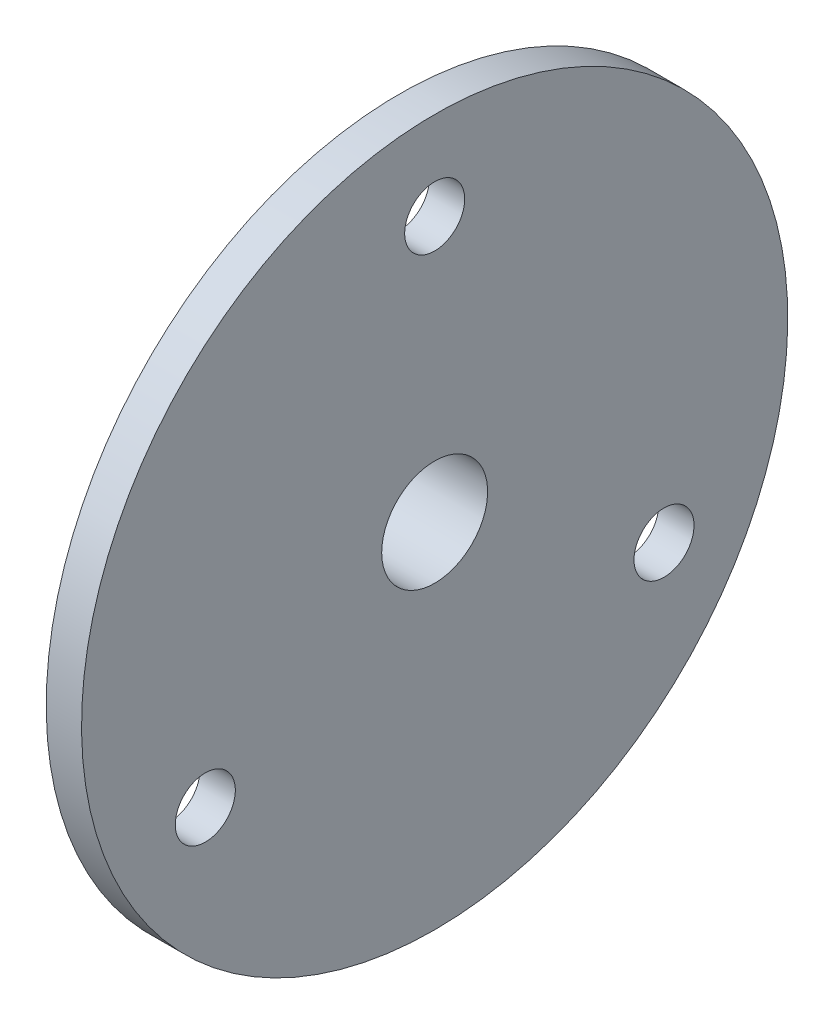
ISO-10303-21;
HEADER;
FILE_DESCRIPTION(('STEP AP214'),'2;1');
FILE_NAME('part.step','',(''),(''),'','','');
FILE_SCHEMA(('AUTOMOTIVE_DESIGN { 1 0 10303 214 1 1 1 1 }'));
ENDSEC;
DATA;
#1=APPLICATION_CONTEXT('core data for automotive mechanical design processes');
#2=APPLICATION_PROTOCOL_DEFINITION('international standard','automotive_design',2000,#1);
#3=PRODUCT_CONTEXT('',#1,'mechanical');
#4=PRODUCT('Part','Part','',(#3));
#5=PRODUCT_RELATED_PRODUCT_CATEGORY('part','',(#4));
#6=PRODUCT_DEFINITION_FORMATION('','',#4);
#7=PRODUCT_DEFINITION_CONTEXT('part definition',#1,'design');
#8=PRODUCT_DEFINITION('design','',#6,#7);
#9=PRODUCT_DEFINITION_SHAPE('','',#8);
#10=(LENGTH_UNIT() NAMED_UNIT(*) SI_UNIT(.MILLI.,.METRE.));
#11=(NAMED_UNIT(*) PLANE_ANGLE_UNIT() SI_UNIT($,.RADIAN.));
#12=(NAMED_UNIT(*) SI_UNIT($,.STERADIAN.) SOLID_ANGLE_UNIT());
#13=UNCERTAINTY_MEASURE_WITH_UNIT(LENGTH_MEASURE(1.E-05),#10,'distance_accuracy_value','');
#14=(GEOMETRIC_REPRESENTATION_CONTEXT(3) GLOBAL_UNCERTAINTY_ASSIGNED_CONTEXT((#13)) GLOBAL_UNIT_ASSIGNED_CONTEXT((#10,
#11,#12)) REPRESENTATION_CONTEXT('',''));
#15=CARTESIAN_POINT('',(0.,0.,0.));
#16=DIRECTION('',(0.,0.,1.));
#17=DIRECTION('',(1.,0.,0.));
#18=AXIS2_PLACEMENT_3D('',#15,#16,#17);
#19=CARTESIAN_POINT('',(1.,0.,0.));
#20=DIRECTION('',(-1.,0.,0.));
#21=DIRECTION('',(0.,-1.,0.));
#22=AXIS2_PLACEMENT_3D('',#19,#20,#21);
#23=PLANE('',#22);
#24=CARTESIAN_POINT('',(0.999999999999898,15.,0.));
#25=DIRECTION('',(-1.,0.,0.));
#26=DIRECTION('',(0.,0.,1.));
#27=AXIS2_PLACEMENT_3D('',#24,#25,#26);
#28=CIRCLE('',#27,1.7);
#29=CARTESIAN_POINT('',(0.999999999999898,15.,1.7));
#30=VERTEX_POINT('',#29);
#31=EDGE_CURVE('E109',#30,#30,#28,.T.);
#32=ORIENTED_EDGE('',*,*,#31,.T.);
#33=EDGE_LOOP('',(#32));
#34=FACE_BOUND('',#33,.T.);
#35=CARTESIAN_POINT('',(0.999999999999902,-7.5,12.9903810567666));
#36=DIRECTION('',(-1.,0.,0.));
#37=DIRECTION('',(0.,0.,1.));
#38=AXIS2_PLACEMENT_3D('',#35,#36,#37);
#39=CIRCLE('',#38,1.7);
#40=CARTESIAN_POINT('',(0.999999999999902,-7.5,14.6903810567666));
#41=VERTEX_POINT('',#40);
#42=EDGE_CURVE('E113',#41,#41,#39,.T.);
#43=ORIENTED_EDGE('',*,*,#42,.T.);
#44=EDGE_LOOP('',(#43));
#45=FACE_BOUND('',#44,.T.);
#46=CARTESIAN_POINT('',(0.999999999999902,-7.5,-12.9903810567666));
#47=DIRECTION('',(-1.,0.,0.));
#48=DIRECTION('',(0.,0.,1.));
#49=AXIS2_PLACEMENT_3D('',#46,#47,#48);
#50=CIRCLE('',#49,1.7);
#51=CARTESIAN_POINT('',(0.999999999999902,-7.5,-11.2903810567666));
#52=VERTEX_POINT('',#51);
#53=EDGE_CURVE('E73',#52,#52,#50,.T.);
#54=ORIENTED_EDGE('',*,*,#53,.T.);
#55=EDGE_LOOP('',(#54));
#56=FACE_BOUND('',#55,.T.);
#57=CARTESIAN_POINT('',(0.999999999999897,0.,0.));
#58=DIRECTION('',(-1.,0.,0.));
#59=DIRECTION('',(0.,0.,1.));
#60=AXIS2_PLACEMENT_3D('',#57,#58,#59);
#61=CIRCLE('',#60,3.);
#62=CARTESIAN_POINT('',(0.999999999999897,0.,3.));
#63=VERTEX_POINT('',#62);
#64=EDGE_CURVE('E61',#63,#63,#61,.T.);
#65=ORIENTED_EDGE('',*,*,#64,.T.);
#66=EDGE_LOOP('',(#65));
#67=FACE_BOUND('',#66,.T.);
#68=CARTESIAN_POINT('',(0.99999999999989,0.,0.));
#69=DIRECTION('',(-1.,0.,0.));
#70=DIRECTION('',(0.,-1.,0.));
#71=AXIS2_PLACEMENT_3D('',#68,#69,#70);
#72=CIRCLE('',#71,20.);
#73=CARTESIAN_POINT('',(0.999999999999894,-20.,0.));
#74=VERTEX_POINT('',#73);
#75=EDGE_CURVE('E45',#74,#74,#72,.T.);
#76=ORIENTED_EDGE('',*,*,#75,.F.);
#77=EDGE_LOOP('',(#76));
#78=FACE_BOUND('',#77,.T.);
#79=ADVANCED_FACE('F35',(#34,#45,#56,#67,#78),#23,.F.);
#80=CARTESIAN_POINT('',(-1031.23106333533,-1.87350135405495E-13,0.));
#81=DIRECTION('',(-1.,0.,0.));
#82=DIRECTION('',(0.,-1.,0.));
#83=AXIS2_PLACEMENT_3D('',#80,#81,#82);
#84=CYLINDRICAL_SURFACE('',#83,20.);
#85=CARTESIAN_POINT('',(-0.99999999999989,0.,0.));
#86=DIRECTION('',(-1.,0.,0.));
#87=DIRECTION('',(0.,-1.,0.));
#88=AXIS2_PLACEMENT_3D('',#85,#86,#87);
#89=CIRCLE('',#88,20.);
#90=CARTESIAN_POINT('',(-0.999999999999886,-20.,0.));
#91=VERTEX_POINT('',#90);
#92=EDGE_CURVE('E49',#91,#91,#89,.T.);
#93=ORIENTED_EDGE('',*,*,#92,.F.);
#94=EDGE_LOOP('',(#93));
#95=FACE_BOUND('',#94,.T.);
#96=ORIENTED_EDGE('',*,*,#75,.T.);
#97=EDGE_LOOP('',(#96));
#98=FACE_BOUND('',#97,.T.);
#99=ADVANCED_FACE('F100',(#95,#98),#84,.T.);
#100=CARTESIAN_POINT('',(-0.999999999999998,5.,0.));
#101=DIRECTION('',(1.,0.,0.));
#102=DIRECTION('',(0.,1.,0.));
#103=AXIS2_PLACEMENT_3D('',#100,#101,#102);
#104=PLANE('',#103);
#105=CARTESIAN_POINT('',(-1.,15.,0.));
#106=DIRECTION('',(-1.,0.,0.));
#107=DIRECTION('',(0.,0.,1.));
#108=AXIS2_PLACEMENT_3D('',#105,#106,#107);
#109=CIRCLE('',#108,1.69999999999999);
#110=CARTESIAN_POINT('',(-1.,15.,1.69999999999999));
#111=VERTEX_POINT('',#110);
#112=EDGE_CURVE('E146',#111,#111,#109,.T.);
#113=ORIENTED_EDGE('',*,*,#112,.F.);
#114=EDGE_LOOP('',(#113));
#115=FACE_BOUND('',#114,.T.);
#116=CARTESIAN_POINT('',(-0.999999999999997,-7.5,12.9903810567666));
#117=DIRECTION('',(-1.,0.,0.));
#118=DIRECTION('',(0.,0.,1.));
#119=AXIS2_PLACEMENT_3D('',#116,#117,#118);
#120=CIRCLE('',#119,1.69999999999999);
#121=CARTESIAN_POINT('',(-0.999999999999997,-7.5,14.6903810567666));
#122=VERTEX_POINT('',#121);
#123=EDGE_CURVE('E150',#122,#122,#120,.T.);
#124=ORIENTED_EDGE('',*,*,#123,.F.);
#125=EDGE_LOOP('',(#124));
#126=FACE_BOUND('',#125,.T.);
#127=CARTESIAN_POINT('',(-0.999999999999997,-7.5,-12.9903810567666));
#128=DIRECTION('',(-1.,0.,0.));
#129=DIRECTION('',(0.,0.,1.));
#130=AXIS2_PLACEMENT_3D('',#127,#128,#129);
#131=CIRCLE('',#130,1.69999999999999);
#132=CARTESIAN_POINT('',(-0.999999999999997,-7.5,-11.2903810567666));
#133=VERTEX_POINT('',#132);
#134=EDGE_CURVE('E153',#133,#133,#131,.T.);
#135=ORIENTED_EDGE('',*,*,#134,.F.);
#136=EDGE_LOOP('',(#135));
#137=FACE_BOUND('',#136,.T.);
#138=CARTESIAN_POINT('',(-0.99999999999989,0.,0.));
#139=DIRECTION('',(-1.,0.,0.));
#140=DIRECTION('',(0.,-1.,0.));
#141=AXIS2_PLACEMENT_3D('',#138,#139,#140);
#142=CIRCLE('',#141,5.);
#143=CARTESIAN_POINT('',(-0.999999999999889,-5.,0.));
#144=VERTEX_POINT('',#143);
#145=EDGE_CURVE('E53',#144,#144,#142,.T.);
#146=ORIENTED_EDGE('',*,*,#145,.F.);
#147=EDGE_LOOP('',(#146));
#148=FACE_BOUND('',#147,.T.);
#149=ORIENTED_EDGE('',*,*,#92,.T.);
#150=EDGE_LOOP('',(#149));
#151=FACE_BOUND('',#150,.T.);
#152=ADVANCED_FACE('F105',(#115,#126,#137,#148,#151),#104,.F.);
#153=CARTESIAN_POINT('',(-1031.23106333533,-1.87350135405495E-13,0.));
#154=DIRECTION('',(-1.,0.,0.));
#155=DIRECTION('',(0.,-1.,0.));
#156=AXIS2_PLACEMENT_3D('',#153,#154,#155);
#157=CYLINDRICAL_SURFACE('',#156,5.);
#158=CARTESIAN_POINT('',(-4.5,4.71990466005406,1.64999999999999));
#159=CARTESIAN_POINT('',(-4.58992939929062,4.71990452115883,1.65000024360503));
#160=CARTESIAN_POINT('',(-4.67985768649969,4.72250292266519,1.64262303818654));
#161=CARTESIAN_POINT('',(-4.85705367343517,4.73256311651638,1.61340616817483));
#162=CARTESIAN_POINT('',(-4.94432088746039,4.74002579119602,1.59156387973589));
#163=CARTESIAN_POINT('',(-5.11359969937907,4.75887919770346,1.53426465819808));
#164=CARTESIAN_POINT('',(-5.19562107766353,4.77026235105614,1.49883397722406));
#165=CARTESIAN_POINT('',(-5.3525814963571,4.79566317693292,1.41545303535855));
#166=CARTESIAN_POINT('',(-5.42751901846369,4.80968141232602,1.36750009878646));
#167=CARTESIAN_POINT('',(-5.57105763938824,4.83937566103107,1.25846654308765));
#168=CARTESIAN_POINT('',(-5.63934748573353,4.85509238793419,1.1969871597991));
#169=CARTESIAN_POINT('',(-5.76485926767888,4.8860682262247,1.06349727663171));
#170=CARTESIAN_POINT('',(-5.82207946546599,4.90132726544298,0.991485126335473));
#171=CARTESIAN_POINT('',(-5.92523358902281,4.93013890958224,0.836704215602397));
#172=CARTESIAN_POINT('',(-5.97084230640668,4.94363804307574,0.753707887278361));
#173=CARTESIAN_POINT('',(-6.04732873484976,4.96692987406679,0.580699685040883));
#174=CARTESIAN_POINT('',(-6.07821033205654,4.97672354920831,0.490689669179503));
#175=CARTESIAN_POINT('',(-6.12331307187515,4.99121262924257,0.309471831071057));
#176=CARTESIAN_POINT('',(-6.13806721498853,4.99607073696453,0.218409916306844));
#177=CARTESIAN_POINT('',(-6.1521899987148,5.00071837425093,0.0349820134684155));
#178=CARTESIAN_POINT('',(-6.15156252784608,5.00050918484353,-0.0573836391159477));
#179=CARTESIAN_POINT('',(-6.13528002545685,4.99515654976728,-0.237027933093925));
#180=CARTESIAN_POINT('',(-6.1202037350628,4.99020313675408,-0.324365615952688));
#181=CARTESIAN_POINT('',(-6.0764073968143,4.9761564157389,-0.49519357766901));
#182=CARTESIAN_POINT('',(-6.04768642917573,4.96706282865059,-0.578683596740282));
#183=CARTESIAN_POINT('',(-5.97707262193577,4.94551338736031,-0.740723104693062));
#184=CARTESIAN_POINT('',(-5.93501331574258,4.93301533884174,-0.819194207586595));
#185=CARTESIAN_POINT('',(-5.83905332496134,4.90596050876767,-0.968137400016378));
#186=CARTESIAN_POINT('',(-5.78514939427669,4.89140316323875,-1.03860728872217));
#187=CARTESIAN_POINT('',(-5.66410482353283,4.86097294536879,-1.1729917525873));
#188=CARTESIAN_POINT('',(-5.59646769426564,4.84507036749807,-1.23645304594368));
#189=CARTESIAN_POINT('',(-5.45137341036442,4.81431124792123,-1.35127700383061));
#190=CARTESIAN_POINT('',(-5.37391480695885,4.79945486104327,-1.4026378802203));
#191=CARTESIAN_POINT('',(-5.20996560114244,4.77230967313122,-1.49241382326107));
#192=CARTESIAN_POINT('',(-5.12336561233862,4.76005891661914,-1.53064150543129));
#193=CARTESIAN_POINT('',(-4.94445239284249,4.73995346804782,-1.59181981773763));
#194=CARTESIAN_POINT('',(-4.85214151654173,4.73209697762927,-1.61477669819906));
#195=CARTESIAN_POINT('',(-4.66880983230074,4.72207527963097,-1.6438468259232));
#196=CARTESIAN_POINT('',(-4.5779131556508,4.71967327795614,-1.65066145601709));
#197=CARTESIAN_POINT('',(-4.39626215211206,4.7201713665852,-1.64923749492086));
#198=CARTESIAN_POINT('',(-4.30550780287081,4.72307051828914,-1.64100156851917));
#199=CARTESIAN_POINT('',(-4.12987992776333,4.73360855675225,-1.61033997123774));
#200=CARTESIAN_POINT('',(-4.04491123060324,4.74108573426459,-1.5883979271959));
#201=CARTESIAN_POINT('',(-3.87987739298326,4.75976051805482,-1.53152522846696));
#202=CARTESIAN_POINT('',(-3.7998131136739,4.77095877549974,-1.49659230032422));
#203=CARTESIAN_POINT('',(-3.64408997295919,4.79624726899171,-1.41348842564754));
#204=CARTESIAN_POINT('',(-3.56864683097438,4.81041691149476,-1.36493806698654));
#205=CARTESIAN_POINT('',(-3.42672439625333,4.83989585604412,-1.25640957990472));
#206=CARTESIAN_POINT('',(-3.36024770467313,4.85520548680903,-1.19642814746825));
#207=CARTESIAN_POINT('',(-3.23491681921652,4.88610989384611,-1.06339123842035));
#208=CARTESIAN_POINT('',(-3.17656776107348,4.9016842503764,-0.989853763923046));
#209=CARTESIAN_POINT('',(-3.07300735840891,4.93065204495412,-0.833649177353401));
#210=CARTESIAN_POINT('',(-3.02779552094755,4.94404556482344,-0.750982407994637));
#211=CARTESIAN_POINT('',(-2.95221100774122,4.96707750850082,-0.579295715379795));
#212=CARTESIAN_POINT('',(-2.92173954125647,4.976740841375,-0.490322802958601));
#213=CARTESIAN_POINT('',(-2.87631330680774,4.99133146825929,-0.308134735858253));
#214=CARTESIAN_POINT('',(-2.86135306153476,4.99626043401974,-0.214921090808601));
#215=CARTESIAN_POINT('',(-2.84785918214314,5.00070328980922,-0.0315225864698995));
#216=CARTESIAN_POINT('',(-2.84859968791083,5.00045646732493,0.05860365806687));
#217=CARTESIAN_POINT('',(-2.86470152427364,4.99516201889142,0.237388028290531));
#218=CARTESIAN_POINT('',(-2.88006170828972,4.99011476942582,0.32604626855399));
#219=CARTESIAN_POINT('',(-2.92448830592424,4.97587240449465,0.498029665785517));
#220=CARTESIAN_POINT('',(-2.95334133491917,4.96674195827475,0.581415680377157));
#221=CARTESIAN_POINT('',(-3.02373789478141,4.94527347683187,0.742196807428919));
#222=CARTESIAN_POINT('',(-3.06528370511946,4.93293486552038,0.819590840669547));
#223=CARTESIAN_POINT('',(-3.16163265392507,4.90576374946711,0.969268380933019));
#224=CARTESIAN_POINT('',(-3.21686414809695,4.89085668492739,1.04126244269286));
#225=CARTESIAN_POINT('',(-3.3382836506441,4.86041514438607,1.17519818555166));
#226=CARTESIAN_POINT('',(-3.40447511929778,4.84488047141097,1.23713667964078));
#227=CARTESIAN_POINT('',(-3.54895585145464,4.81423121094682,1.35160179814246));
#228=CARTESIAN_POINT('',(-3.62761026948916,4.79915525016868,1.40367929286429));
#229=CARTESIAN_POINT('',(-3.79302166212418,4.77186368687929,1.49383628223877));
#230=CARTESIAN_POINT('',(-3.87977631283495,4.759647267495,1.5319197762739));
#231=CARTESIAN_POINT('',(-4.05434327244323,4.74014636717988,1.59120734764471));
#232=CARTESIAN_POINT('',(-4.14186804193521,4.7326392026776,1.61318355190477));
#233=CARTESIAN_POINT('',(-4.31959617129269,4.72251921935149,1.64257737451178));
#234=CARTESIAN_POINT('',(-4.40979864505525,4.71990479936932,1.64999975565827));
#235=CARTESIAN_POINT('',(-4.5,4.71990466005406,1.64999999999999));
#236=B_SPLINE_CURVE_WITH_KNOTS('',3,(#158,#159,#160,#161,#162,#163,#164,#165,#166,#167,#168,
#169,#170,#171,#172,#173,#174,#175,#176,#177,#178,#179,#180,#181,#182,#183,#184,#185,#186,#187,
#188,#189,#190,#191,#192,#193,#194,#195,#196,#197,#198,#199,#200,#201,#202,#203,#204,#205,#206,
#207,#208,#209,#210,#211,#212,#213,#214,#215,#216,#217,#218,#219,#220,#221,#222,#223,#224,#225,
#226,#227,#228,#229,#230,#231,#232,#233,#234,#235),.UNSPECIFIED.,.T.,.F.,(4,2,2,2,2,2,2,2,2,2,2,
2,2,2,2,2,2,2,2,2,2,2,2,2,2,2,2,2,2,2,2,2,2,2,2,2,2,2,4),(0.,0.269454302916433,
0.538957495994023,0.807942623457627,1.07698527314816,1.35539043483169,1.63383926765626,
1.91939248597707,2.20487031163409,2.48059787689521,2.75625573811557,3.02131448573183,
3.28639110342469,3.55491555402298,3.82351368748602,4.10452131305697,4.38557043856027,
4.67047751353533,4.95526790443247,5.22743703243197,5.49955797597571,5.76258081799805,
6.02564971172705,6.29693565916081,6.56830013781583,6.85241935986187,7.13652791970019,
7.41870503995778,7.70078248410445,7.96984890311452,8.23889422176273,8.50382155957886,
8.76879650315112,9.04343817678382,9.3181667260818,9.60337461850673,9.88850093710111,
10.1588585876966,10.4291277478431),.UNSPECIFIED.);
#237=CARTESIAN_POINT('',(-4.5,4.71990466005406,1.64999999999999));
#238=VERTEX_POINT('',#237);
#239=EDGE_CURVE('E10',#238,#238,#236,.T.);
#240=ORIENTED_EDGE('',*,*,#239,.T.);
#241=EDGE_LOOP('',(#240));
#242=FACE_BOUND('',#241,.T.);
#243=CARTESIAN_POINT('',(-8.00000000000001,0.,0.));
#244=DIRECTION('',(-1.,0.,0.));
#245=DIRECTION('',(0.,-1.,0.));
#246=AXIS2_PLACEMENT_3D('',#243,#244,#245);
#247=CIRCLE('',#246,5.);
#248=CARTESIAN_POINT('',(-8.00000000000001,-5.,0.));
#249=VERTEX_POINT('',#248);
#250=EDGE_CURVE('E58',#249,#249,#247,.T.);
#251=ORIENTED_EDGE('',*,*,#250,.F.);
#252=EDGE_LOOP('',(#251));
#253=FACE_BOUND('',#252,.T.);
#254=ORIENTED_EDGE('',*,*,#145,.T.);
#255=EDGE_LOOP('',(#254));
#256=FACE_BOUND('',#255,.T.);
#257=ADVANCED_FACE('F128',(#242,#253,#256),#157,.T.);
#258=CARTESIAN_POINT('',(-8.,0.,0.));
#259=DIRECTION('',(1.,0.,0.));
#260=DIRECTION('',(0.,1.,0.));
#261=AXIS2_PLACEMENT_3D('',#258,#259,#260);
#262=PLANE('',#261);
#263=CARTESIAN_POINT('',(-8.,0.,0.));
#264=DIRECTION('',(-1.,0.,0.));
#265=DIRECTION('',(0.,0.,1.));
#266=AXIS2_PLACEMENT_3D('',#263,#264,#265);
#267=CIRCLE('',#266,3.);
#268=CARTESIAN_POINT('',(-8.,0.,3.));
#269=VERTEX_POINT('',#268);
#270=EDGE_CURVE('E64',#269,#269,#267,.T.);
#271=ORIENTED_EDGE('',*,*,#270,.F.);
#272=EDGE_LOOP('',(#271));
#273=FACE_BOUND('',#272,.T.);
#274=ORIENTED_EDGE('',*,*,#250,.T.);
#275=EDGE_LOOP('',(#274));
#276=FACE_BOUND('',#275,.T.);
#277=ADVANCED_FACE('F122',(#273,#276),#262,.F.);
#278=CARTESIAN_POINT('',(-8.,0.,0.));
#279=DIRECTION('',(-1.,0.,0.));
#280=DIRECTION('',(0.,0.,1.));
#281=AXIS2_PLACEMENT_3D('',#278,#279,#280);
#282=CYLINDRICAL_SURFACE('',#281,3.);
#283=CARTESIAN_POINT('',(-4.5,2.50549396327351,1.64999999999999));
#284=CARTESIAN_POINT('',(-4.41543775587578,2.50550290729145,1.64999358115514));
#285=CARTESIAN_POINT('',(-4.33080158035625,2.50984278304633,1.64345412095508));
#286=CARTESIAN_POINT('',(-4.16424198934389,2.52652305472093,1.61768357796128));
#287=CARTESIAN_POINT('',(-4.08232339226291,2.5388769381334,1.59843109830519));
#288=CARTESIAN_POINT('',(-3.92394184165835,2.56969514424061,1.54839133504121));
#289=CARTESIAN_POINT('',(-3.84744833636022,2.58812128253767,1.51767597794515));
#290=CARTESIAN_POINT('',(-3.70072925067674,2.62894573960704,1.44580368027315));
#291=CARTESIAN_POINT('',(-3.63050498062123,2.65134488586739,1.40464456372701));
#292=CARTESIAN_POINT('',(-3.49050697951391,2.70034227169485,1.30818987552102));
#293=CARTESIAN_POINT('',(-3.42149614307965,2.72713610292843,1.25188597568528));
#294=CARTESIAN_POINT('',(-3.29328457524384,2.78033402122329,1.12882249865068));
#295=CARTESIAN_POINT('',(-3.23408972055437,2.8067378662503,1.06205670422282));
#296=CARTESIAN_POINT('',(-3.12218721247504,2.85888255333956,0.912984038802338));
#297=CARTESIAN_POINT('',(-3.07047291087437,2.88437182872328,0.829835009326249));
#298=CARTESIAN_POINT('',(-2.98212209381967,2.92916377464779,0.65434955639789));
#299=CARTESIAN_POINT('',(-2.94547408910424,2.94847115688416,0.562020200659681));
#300=CARTESIAN_POINT('',(-2.89150601520037,2.9772938233039,0.378922854343169));
#301=CARTESIAN_POINT('',(-2.87283185672805,2.98749000620555,0.288663762188306));
#302=CARTESIAN_POINT('',(-2.85082522164806,2.99953120217528,0.105768848971923));
#303=CARTESIAN_POINT('',(-2.84748111400143,3.00138254652495,0.0131348834272864));
#304=CARTESIAN_POINT('',(-2.8558401237369,2.99679126383707,-0.161456942743378));
#305=CARTESIAN_POINT('',(-2.86600430103804,2.99119680588262,-0.243517036042416));
#306=CARTESIAN_POINT('',(-2.89825613933327,2.97370139090637,-0.404548934713679));
#307=CARTESIAN_POINT('',(-2.92034471597395,2.96179994958743,-0.483520502425807));
#308=CARTESIAN_POINT('',(-2.97581759545011,2.93258792133284,-0.637279429786406));
#309=CARTESIAN_POINT('',(-3.00932095125488,2.91522047737549,-0.71201258706549));
#310=CARTESIAN_POINT('',(-3.08643144614225,2.87655421939416,-0.854941741305336));
#311=CARTESIAN_POINT('',(-3.13004181718505,2.85525414826244,-0.923135637298118));
#312=CARTESIAN_POINT('',(-3.23148475004153,2.80791814382437,-1.05891717191853));
#313=CARTESIAN_POINT('',(-3.29034393087261,2.78161920172534,-1.12564617195585));
#314=CARTESIAN_POINT('',(-3.41792420544975,2.72855637999779,-1.24879377983835));
#315=CARTESIAN_POINT('',(-3.48665544125848,2.70179204741386,-1.30520164705459));
#316=CARTESIAN_POINT('',(-3.63929795422943,2.64816260741378,-1.41104757147092));
#317=CARTESIAN_POINT('',(-3.72401217497651,2.62149493557528,-1.45943898084593));
#318=CARTESIAN_POINT('',(-3.9020876587557,2.57442669454811,-1.54096072440201));
#319=CARTESIAN_POINT('',(-3.99543877389511,2.55401888906632,-1.57410870202277));
#320=CARTESIAN_POINT('',(-4.18038243391405,2.52428868885372,-1.62132480747599));
#321=CARTESIAN_POINT('',(-4.27150770718116,2.51420388175754,-1.63671808149071));
#322=CARTESIAN_POINT('',(-4.45556143260455,2.50421132283931,-1.65197600548299));
#323=CARTESIAN_POINT('',(-4.5484877010052,2.50429193328554,-1.65185841284551));
#324=CARTESIAN_POINT('',(-4.71898069677552,2.51381291635781,-1.63731066997579));
#325=CARTESIAN_POINT('',(-4.79681676278818,2.52189118280773,-1.62496327579089));
#326=CARTESIAN_POINT('',(-4.9490948427084,2.54430898316227,-1.58963092545287));
#327=CARTESIAN_POINT('',(-5.02353535119722,2.55865126498177,-1.56664130047228));
#328=CARTESIAN_POINT('',(-5.17056841434069,2.59264701052962,-1.50974087534156));
#329=CARTESIAN_POINT('',(-5.24295082069503,2.61249886195853,-1.47541058671724));
#330=CARTESIAN_POINT('',(-5.38136153298298,2.6551752562818,-1.3971508807439));
#331=CARTESIAN_POINT('',(-5.44738667198258,2.67800126759515,-1.35321671440463));
#332=CARTESIAN_POINT('',(-5.58217598283305,2.72838745980259,-1.24890384728534));
#333=CARTESIAN_POINT('',(-5.64971665545364,2.75612471210542,-1.18702256034846));
#334=CARTESIAN_POINT('',(-5.77394463458244,2.81021466477288,-1.05259034248067));
#335=CARTESIAN_POINT('',(-5.83062557660594,2.83656654669951,-0.980033198593367));
#336=CARTESIAN_POINT('',(-5.93418356477833,2.88655886174343,-0.821591432017614));
#337=CARTESIAN_POINT('',(-5.98041980778174,2.90999476284885,-0.73521836449538));
#338=CARTESIAN_POINT('',(-6.05721430537586,2.94980224898628,-0.554269536180258));
#339=CARTESIAN_POINT('',(-6.08778886056152,2.96618117604292,-0.459702424085388));
#340=CARTESIAN_POINT('',(-6.12930611839182,2.98862325067975,-0.275417797995452));
#341=CARTESIAN_POINT('',(-6.14193096934434,2.99556705432428,-0.186187129425333));
#342=CARTESIAN_POINT('',(-6.15243189343454,3.00133436858647,-0.00661676308886146));
#343=CARTESIAN_POINT('',(-6.15031573581961,3.00016215675141,0.0837223254250963));
#344=CARTESIAN_POINT('',(-6.13233007153812,2.99031042427524,0.254358366297034));
#345=CARTESIAN_POINT('',(-6.11770633320566,2.98231104671828,0.334831363047836));
#346=CARTESIAN_POINT('',(-6.07703517800952,2.96044701025379,0.49198583387688));
#347=CARTESIAN_POINT('',(-6.05098639804465,2.94658165149357,0.568666854326149));
#348=CARTESIAN_POINT('',(-5.98738736796037,2.91359875185443,0.719080279481093));
#349=CARTESIAN_POINT('',(-5.94947440595497,2.89431787940931,0.792622296205402));
#350=CARTESIAN_POINT('',(-5.86367449851232,2.85231650614788,0.932542405269453));
#351=CARTESIAN_POINT('',(-5.81578351940047,2.82959461529654,0.998917583844718));
#352=CARTESIAN_POINT('',(-5.70507399834961,2.77974517125015,1.13072210629174));
#353=CARTESIAN_POINT('',(-5.64117216627432,2.75241145940814,1.19516495605846));
#354=CARTESIAN_POINT('',(-5.50349286244808,2.69823878537054,1.31290440702821));
#355=CARTESIAN_POINT('',(-5.42970353472664,2.67140046184162,1.36618742691371));
#356=CARTESIAN_POINT('',(-5.26827599994855,2.61945108088931,1.46345962344262));
#357=CARTESIAN_POINT('',(-5.18004360140734,2.59457299089604,1.50659692748028));
#358=CARTESIAN_POINT('',(-4.99582119959131,2.55252885584285,1.57680093269354));
#359=CARTESIAN_POINT('',(-4.89985704717182,2.53533827536757,1.60391885150153));
#360=CARTESIAN_POINT('',(-4.75219121694153,2.5176692541321,1.6313948659609));
#361=CARTESIAN_POINT('',(-4.70212523584002,2.51313062613142,1.63835444049929));
#362=CARTESIAN_POINT('',(-4.60138168759252,2.50704033236465,1.64765888075614));
#363=CARTESIAN_POINT('',(-4.55070413403086,2.50548860037558,1.65000384878585));
#364=CARTESIAN_POINT('',(-4.5,2.50549396327351,1.64999999999999));
#365=B_SPLINE_CURVE_WITH_KNOTS('',3,(#283,#284,#285,#286,#287,#288,#289,#290,#291,#292,#293,
#294,#295,#296,#297,#298,#299,#300,#301,#302,#303,#304,#305,#306,#307,#308,#309,#310,#311,#312,
#313,#314,#315,#316,#317,#318,#319,#320,#321,#322,#323,#324,#325,#326,#327,#328,#329,#330,#331,
#332,#333,#334,#335,#336,#337,#338,#339,#340,#341,#342,#343,#344,#345,#346,#347,#348,#349,#350,
#351,#352,#353,#354,#355,#356,#357,#358,#359,#360,#361,#362,#363,#364),.UNSPECIFIED.,.T.,.F.,(4,
2,2,2,2,2,2,2,2,2,2,2,2,2,2,2,2,2,2,2,2,2,2,2,2,2,2,2,2,2,2,2,2,2,2,2,2,2,2,2,4),(0.,
0.253471464978916,0.507370630471962,0.759702723718414,1.0120874338999,1.28998079678324,
1.56803993512379,1.86997289364919,2.17167517502775,2.44828286528194,2.72468065617497,
2.97213663093979,3.21961160997026,3.46975098230537,3.71997045333204,3.99717687977862,
4.27467015892955,4.57652503396565,4.87802964361059,5.1551747562746,5.43200258623577,
5.66859462056206,5.90529054812098,6.15196333618106,6.39875837770521,6.68465599353129,
6.97072065421033,7.2712528668623,7.57147164850531,7.8411174720333,8.11062118950828,
8.35604451303952,8.60149712555496,8.85533990697403,9.10928550569672,9.39243346006445,
9.67592402360684,9.9782355672993,10.2795752459721,10.4315619419379,10.5835452681421),.UNSPECIFIED.);
#366=CARTESIAN_POINT('',(-4.5,2.50549396327351,1.64999999999999));
#367=VERTEX_POINT('',#366);
#368=EDGE_CURVE('E67',#367,#367,#365,.T.);
#369=ORIENTED_EDGE('',*,*,#368,.T.);
#370=EDGE_LOOP('',(#369));
#371=FACE_BOUND('',#370,.T.);
#372=ORIENTED_EDGE('',*,*,#64,.F.);
#373=EDGE_LOOP('',(#372));
#374=FACE_BOUND('',#373,.T.);
#375=ORIENTED_EDGE('',*,*,#270,.T.);
#376=EDGE_LOOP('',(#375));
#377=FACE_BOUND('',#376,.T.);
#378=ADVANCED_FACE('F75',(#371,#374,#377),#282,.F.);
#379=CARTESIAN_POINT('',(-4.5,5.,0.));
#380=DIRECTION('',(0.,1.,0.));
#381=DIRECTION('',(0.,0.,1.));
#382=AXIS2_PLACEMENT_3D('',#379,#380,#381);
#383=CYLINDRICAL_SURFACE('',#382,1.64999999999999);
#384=ORIENTED_EDGE('',*,*,#239,.F.);
#385=EDGE_LOOP('',(#384));
#386=FACE_BOUND('',#385,.T.);
#387=ORIENTED_EDGE('',*,*,#368,.F.);
#388=EDGE_LOOP('',(#387));
#389=FACE_BOUND('',#388,.T.);
#390=ADVANCED_FACE('F78',(#386,#389),#383,.F.);
#391=CARTESIAN_POINT('',(-0.999999999999996,-7.5,-12.9903810567666));
#392=DIRECTION('',(-1.,0.,0.));
#393=DIRECTION('',(0.,0.,1.));
#394=AXIS2_PLACEMENT_3D('',#391,#392,#393);
#395=CYLINDRICAL_SURFACE('',#394,1.69999999999999);
#396=ORIENTED_EDGE('',*,*,#53,.F.);
#397=EDGE_LOOP('',(#396));
#398=FACE_BOUND('',#397,.T.);
#399=ORIENTED_EDGE('',*,*,#134,.T.);
#400=EDGE_LOOP('',(#399));
#401=FACE_BOUND('',#400,.T.);
#402=ADVANCED_FACE('F82',(#398,#401),#395,.F.);
#403=CARTESIAN_POINT('',(-0.999999999999996,-7.5,12.9903810567666));
#404=DIRECTION('',(-1.,0.,0.));
#405=DIRECTION('',(0.,0.,1.));
#406=AXIS2_PLACEMENT_3D('',#403,#404,#405);
#407=CYLINDRICAL_SURFACE('',#406,1.69999999999999);
#408=ORIENTED_EDGE('',*,*,#42,.F.);
#409=EDGE_LOOP('',(#408));
#410=FACE_BOUND('',#409,.T.);
#411=ORIENTED_EDGE('',*,*,#123,.T.);
#412=EDGE_LOOP('',(#411));
#413=FACE_BOUND('',#412,.T.);
#414=ADVANCED_FACE('F87',(#410,#413),#407,.F.);
#415=CARTESIAN_POINT('',(-1.,15.,0.));
#416=DIRECTION('',(-1.,0.,0.));
#417=DIRECTION('',(0.,0.,1.));
#418=AXIS2_PLACEMENT_3D('',#415,#416,#417);
#419=CYLINDRICAL_SURFACE('',#418,1.69999999999999);
#420=ORIENTED_EDGE('',*,*,#31,.F.);
#421=EDGE_LOOP('',(#420));
#422=FACE_BOUND('',#421,.T.);
#423=ORIENTED_EDGE('',*,*,#112,.T.);
#424=EDGE_LOOP('',(#423));
#425=FACE_BOUND('',#424,.T.);
#426=ADVANCED_FACE('F91',(#422,#425),#419,.F.);
#427=CLOSED_SHELL('',(#79,#99,#152,#257,#277,#378,#390,#402,#414,#426));
#428=MANIFOLD_SOLID_BREP('B2',#427);
#429=ADVANCED_BREP_SHAPE_REPRESENTATION('',(#18,#428),#14);
#430=SHAPE_DEFINITION_REPRESENTATION(#9,#429);
ENDSEC;
END-ISO-10303-21;
